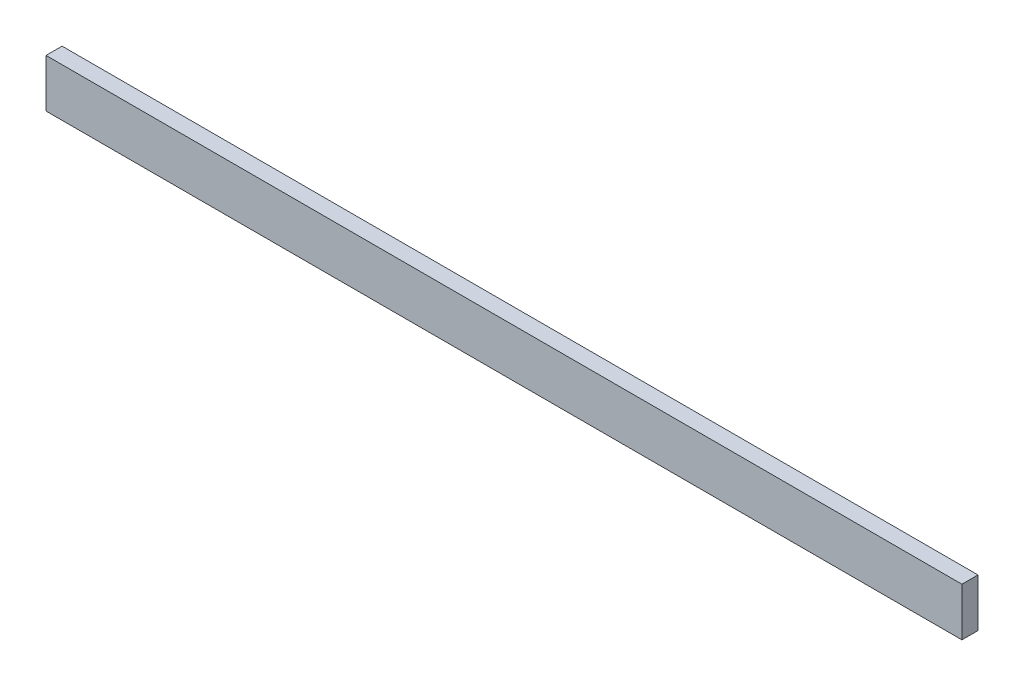
ISO-10303-21;
HEADER;
FILE_DESCRIPTION(('STEP AP214'),'2;1');
FILE_NAME('part.step','',(''),(''),'','','');
FILE_SCHEMA(('AUTOMOTIVE_DESIGN { 1 0 10303 214 1 1 1 1 }'));
ENDSEC;
DATA;
#1=APPLICATION_CONTEXT('core data for automotive mechanical design processes');
#2=APPLICATION_PROTOCOL_DEFINITION('international standard','automotive_design',2000,#1);
#3=PRODUCT_CONTEXT('',#1,'mechanical');
#4=PRODUCT('Part','Part','',(#3));
#5=PRODUCT_RELATED_PRODUCT_CATEGORY('part','',(#4));
#6=PRODUCT_DEFINITION_FORMATION('','',#4);
#7=PRODUCT_DEFINITION_CONTEXT('part definition',#1,'design');
#8=PRODUCT_DEFINITION('design','',#6,#7);
#9=PRODUCT_DEFINITION_SHAPE('','',#8);
#10=(LENGTH_UNIT() NAMED_UNIT(*) SI_UNIT(.MILLI.,.METRE.));
#11=(NAMED_UNIT(*) PLANE_ANGLE_UNIT() SI_UNIT($,.RADIAN.));
#12=(NAMED_UNIT(*) SI_UNIT($,.STERADIAN.) SOLID_ANGLE_UNIT());
#13=UNCERTAINTY_MEASURE_WITH_UNIT(LENGTH_MEASURE(1.E-05),#10,'distance_accuracy_value','');
#14=(GEOMETRIC_REPRESENTATION_CONTEXT(3) GLOBAL_UNCERTAINTY_ASSIGNED_CONTEXT((#13)) GLOBAL_UNIT_ASSIGNED_CONTEXT((#10,
#11,#12)) REPRESENTATION_CONTEXT('',''));
#15=CARTESIAN_POINT('',(0.,0.,0.));
#16=DIRECTION('',(0.,0.,1.));
#17=DIRECTION('',(1.,0.,0.));
#18=AXIS2_PLACEMENT_3D('',#15,#16,#17);
#19=CARTESIAN_POINT('',(0.,0.,12.7));
#20=DIRECTION('',(1.,0.,0.));
#21=DIRECTION('',(0.,0.,-1.));
#22=AXIS2_PLACEMENT_3D('',#19,#20,#21);
#23=PLANE('',#22);
#24=DIRECTION('',(0.,-1.,0.));
#25=VECTOR('',#24,1.);
#26=CARTESIAN_POINT('',(0.,0.,0.));
#27=LINE('',#26,#25);
#28=CARTESIAN_POINT('',(0.,38.1,0.));
#29=VERTEX_POINT('',#28);
#30=CARTESIAN_POINT('',(0.,0.,0.));
#31=VERTEX_POINT('',#30);
#32=EDGE_CURVE('E107',#29,#31,#27,.T.);
#33=ORIENTED_EDGE('',*,*,#32,.T.);
#34=DIRECTION('',(0.,0.,-1.));
#35=VECTOR('',#34,1.);
#36=CARTESIAN_POINT('',(0.,0.,12.7));
#37=LINE('',#36,#35);
#38=CARTESIAN_POINT('',(0.,0.,12.7));
#39=VERTEX_POINT('',#38);
#40=EDGE_CURVE('E11',#39,#31,#37,.T.);
#41=ORIENTED_EDGE('',*,*,#40,.F.);
#42=DIRECTION('',(0.,-1.,0.));
#43=VECTOR('',#42,1.);
#44=CARTESIAN_POINT('',(0.,0.,12.7));
#45=LINE('',#44,#43);
#46=CARTESIAN_POINT('',(0.,38.1,12.7));
#47=VERTEX_POINT('',#46);
#48=EDGE_CURVE('E91',#47,#39,#45,.T.);
#49=ORIENTED_EDGE('',*,*,#48,.F.);
#50=DIRECTION('',(0.,0.,-1.));
#51=VECTOR('',#50,1.);
#52=CARTESIAN_POINT('',(0.,38.1,12.7));
#53=LINE('',#52,#51);
#54=EDGE_CURVE('E103',#47,#29,#53,.T.);
#55=ORIENTED_EDGE('',*,*,#54,.T.);
#56=EDGE_LOOP('',(#33,#41,#49,#55));
#57=FACE_BOUND('',#56,.T.);
#58=ADVANCED_FACE('F39',(#57),#23,.F.);
#59=CARTESIAN_POINT('',(0.,0.,12.7));
#60=DIRECTION('',(0.,1.,0.));
#61=DIRECTION('',(0.,0.,1.));
#62=AXIS2_PLACEMENT_3D('',#59,#60,#61);
#63=PLANE('',#62);
#64=DIRECTION('',(1.,0.,0.));
#65=VECTOR('',#64,1.);
#66=CARTESIAN_POINT('',(0.,0.,0.));
#67=LINE('',#66,#65);
#68=CARTESIAN_POINT('',(723.9,0.,0.));
#69=VERTEX_POINT('',#68);
#70=EDGE_CURVE('E96',#31,#69,#67,.T.);
#71=ORIENTED_EDGE('',*,*,#70,.T.);
#72=DIRECTION('',(0.,0.,-1.));
#73=VECTOR('',#72,1.);
#74=CARTESIAN_POINT('',(723.9,0.,12.7));
#75=LINE('',#74,#73);
#76=CARTESIAN_POINT('',(723.9,0.,12.7));
#77=VERTEX_POINT('',#76);
#78=EDGE_CURVE('E48',#77,#69,#75,.T.);
#79=ORIENTED_EDGE('',*,*,#78,.F.);
#80=DIRECTION('',(1.,0.,0.));
#81=VECTOR('',#80,1.);
#82=CARTESIAN_POINT('',(0.,0.,12.7));
#83=LINE('',#82,#81);
#84=EDGE_CURVE('E86',#39,#77,#83,.T.);
#85=ORIENTED_EDGE('',*,*,#84,.F.);
#86=ORIENTED_EDGE('',*,*,#40,.T.);
#87=EDGE_LOOP('',(#71,#79,#85,#86));
#88=FACE_BOUND('',#87,.T.);
#89=ADVANCED_FACE('F95',(#88),#63,.F.);
#90=CARTESIAN_POINT('',(723.9,0.,12.7));
#91=DIRECTION('',(-1.,0.,0.));
#92=DIRECTION('',(0.,0.,1.));
#93=AXIS2_PLACEMENT_3D('',#90,#91,#92);
#94=PLANE('',#93);
#95=DIRECTION('',(0.,1.,0.));
#96=VECTOR('',#95,1.);
#97=CARTESIAN_POINT('',(723.9,0.,0.));
#98=LINE('',#97,#96);
#99=CARTESIAN_POINT('',(723.9,38.1,0.));
#100=VERTEX_POINT('',#99);
#101=EDGE_CURVE('E73',#69,#100,#98,.T.);
#102=ORIENTED_EDGE('',*,*,#101,.T.);
#103=DIRECTION('',(0.,0.,-1.));
#104=VECTOR('',#103,1.);
#105=CARTESIAN_POINT('',(723.9,38.1,12.7));
#106=LINE('',#105,#104);
#107=CARTESIAN_POINT('',(723.9,38.1,12.7));
#108=VERTEX_POINT('',#107);
#109=EDGE_CURVE('E98',#108,#100,#106,.T.);
#110=ORIENTED_EDGE('',*,*,#109,.F.);
#111=DIRECTION('',(0.,1.,0.));
#112=VECTOR('',#111,1.);
#113=CARTESIAN_POINT('',(723.9,0.,12.7));
#114=LINE('',#113,#112);
#115=EDGE_CURVE('E89',#77,#108,#114,.T.);
#116=ORIENTED_EDGE('',*,*,#115,.F.);
#117=ORIENTED_EDGE('',*,*,#78,.T.);
#118=EDGE_LOOP('',(#102,#110,#116,#117));
#119=FACE_BOUND('',#118,.T.);
#120=ADVANCED_FACE('F99',(#119),#94,.F.);
#121=CARTESIAN_POINT('',(0.,38.1,12.7));
#122=DIRECTION('',(0.,-1.,0.));
#123=DIRECTION('',(0.,0.,-1.));
#124=AXIS2_PLACEMENT_3D('',#121,#122,#123);
#125=PLANE('',#124);
#126=DIRECTION('',(-1.,0.,0.));
#127=VECTOR('',#126,1.);
#128=CARTESIAN_POINT('',(0.,38.1,0.));
#129=LINE('',#128,#127);
#130=EDGE_CURVE('E79',#100,#29,#129,.T.);
#131=ORIENTED_EDGE('',*,*,#130,.T.);
#132=ORIENTED_EDGE('',*,*,#54,.F.);
#133=DIRECTION('',(-1.,0.,0.));
#134=VECTOR('',#133,1.);
#135=CARTESIAN_POINT('',(0.,38.1,12.7));
#136=LINE('',#135,#134);
#137=EDGE_CURVE('E56',#108,#47,#136,.T.);
#138=ORIENTED_EDGE('',*,*,#137,.F.);
#139=ORIENTED_EDGE('',*,*,#109,.T.);
#140=EDGE_LOOP('',(#131,#132,#138,#139));
#141=FACE_BOUND('',#140,.T.);
#142=ADVANCED_FACE('F120',(#141),#125,.F.);
#143=CARTESIAN_POINT('',(0.,0.,12.7));
#144=DIRECTION('',(0.,0.,-1.));
#145=DIRECTION('',(-1.,0.,0.));
#146=AXIS2_PLACEMENT_3D('',#143,#144,#145);
#147=PLANE('',#146);
#148=ORIENTED_EDGE('',*,*,#48,.T.);
#149=ORIENTED_EDGE('',*,*,#84,.T.);
#150=ORIENTED_EDGE('',*,*,#115,.T.);
#151=ORIENTED_EDGE('',*,*,#137,.T.);
#152=EDGE_LOOP('',(#148,#149,#150,#151));
#153=FACE_BOUND('',#152,.T.);
#154=ADVANCED_FACE('F87',(#153),#147,.F.);
#155=CARTESIAN_POINT('',(0.,0.,0.));
#156=DIRECTION('',(0.,0.,-1.));
#157=DIRECTION('',(-1.,0.,0.));
#158=AXIS2_PLACEMENT_3D('',#155,#156,#157);
#159=PLANE('',#158);
#160=ORIENTED_EDGE('',*,*,#32,.F.);
#161=ORIENTED_EDGE('',*,*,#130,.F.);
#162=ORIENTED_EDGE('',*,*,#101,.F.);
#163=ORIENTED_EDGE('',*,*,#70,.F.);
#164=EDGE_LOOP('',(#160,#161,#162,#163));
#165=FACE_BOUND('',#164,.T.);
#166=ADVANCED_FACE('F123',(#165),#159,.T.);
#167=CLOSED_SHELL('',(#58,#89,#120,#142,#154,#166));
#168=MANIFOLD_SOLID_BREP('B2',#167);
#169=ADVANCED_BREP_SHAPE_REPRESENTATION('',(#18,#168),#14);
#170=SHAPE_DEFINITION_REPRESENTATION(#9,#169);
ENDSEC;
END-ISO-10303-21;
